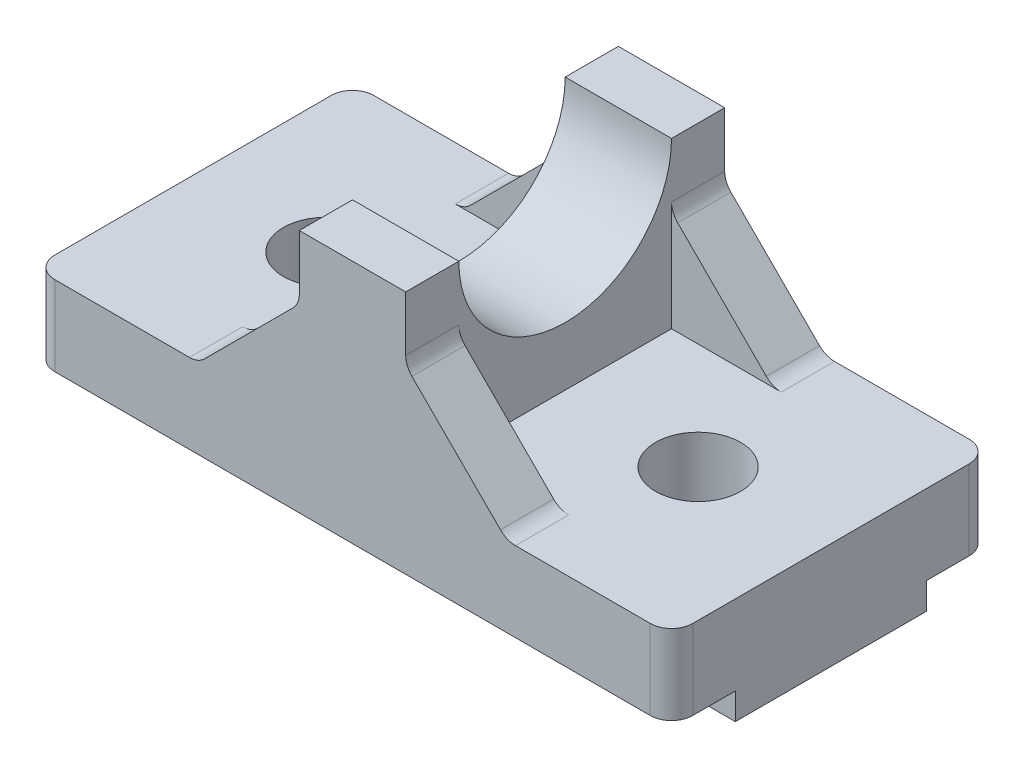
ISO-10303-21;
HEADER;
FILE_DESCRIPTION(('STEP AP214'),'2;1');
FILE_NAME('part.step','',(''),(''),'','','');
FILE_SCHEMA(('AUTOMOTIVE_DESIGN { 1 0 10303 214 1 1 1 1 }'));
ENDSEC;
DATA;
#1=APPLICATION_CONTEXT('core data for automotive mechanical design processes');
#2=APPLICATION_PROTOCOL_DEFINITION('international standard','automotive_design',2000,#1);
#3=PRODUCT_CONTEXT('',#1,'mechanical');
#4=PRODUCT('Part','Part','',(#3));
#5=PRODUCT_RELATED_PRODUCT_CATEGORY('part','',(#4));
#6=PRODUCT_DEFINITION_FORMATION('','',#4);
#7=PRODUCT_DEFINITION_CONTEXT('part definition',#1,'design');
#8=PRODUCT_DEFINITION('design','',#6,#7);
#9=PRODUCT_DEFINITION_SHAPE('','',#8);
#10=(LENGTH_UNIT() NAMED_UNIT(*) SI_UNIT(.MILLI.,.METRE.));
#11=(NAMED_UNIT(*) PLANE_ANGLE_UNIT() SI_UNIT($,.RADIAN.));
#12=(NAMED_UNIT(*) SI_UNIT($,.STERADIAN.) SOLID_ANGLE_UNIT());
#13=UNCERTAINTY_MEASURE_WITH_UNIT(LENGTH_MEASURE(1.E-05),#10,'distance_accuracy_value','');
#14=(GEOMETRIC_REPRESENTATION_CONTEXT(3) GLOBAL_UNCERTAINTY_ASSIGNED_CONTEXT((#13)) GLOBAL_UNIT_ASSIGNED_CONTEXT((#10,
#11,#12)) REPRESENTATION_CONTEXT('',''));
#15=CARTESIAN_POINT('',(0.,0.,0.));
#16=DIRECTION('',(0.,0.,1.));
#17=DIRECTION('',(1.,0.,0.));
#18=AXIS2_PLACEMENT_3D('',#15,#16,#17);
#19=CARTESIAN_POINT('',(10.,46.,30.));
#20=DIRECTION('',(0.,-1.,0.));
#21=DIRECTION('',(0.,0.,-1.));
#22=AXIS2_PLACEMENT_3D('',#19,#20,#21);
#23=PLANE('',#22);
#24=DIRECTION('',(1.,0.,0.));
#25=VECTOR('',#24,1.);
#26=CARTESIAN_POINT('',(-240.23417352045,45.9999999999999,20.));
#27=LINE('',#26,#25);
#28=CARTESIAN_POINT('',(-10.0000000000001,46.,20.));
#29=VERTEX_POINT('',#28);
#30=CARTESIAN_POINT('',(10.,46.,20.));
#31=VERTEX_POINT('',#30);
#32=EDGE_CURVE('E267',#29,#31,#27,.T.);
#33=ORIENTED_EDGE('',*,*,#32,.F.);
#34=DIRECTION('',(0.,0.,-1.));
#35=VECTOR('',#34,1.);
#36=CARTESIAN_POINT('',(-10.,46.,30.));
#37=LINE('',#36,#35);
#38=CARTESIAN_POINT('',(-10.,46.,30.));
#39=VERTEX_POINT('',#38);
#40=EDGE_CURVE('E256',#39,#29,#37,.T.);
#41=ORIENTED_EDGE('',*,*,#40,.F.);
#42=DIRECTION('',(-1.,0.,0.));
#43=VECTOR('',#42,1.);
#44=CARTESIAN_POINT('',(10.,46.,30.));
#45=LINE('',#44,#43);
#46=CARTESIAN_POINT('',(10.,46.,30.));
#47=VERTEX_POINT('',#46);
#48=EDGE_CURVE('E382',#47,#39,#45,.T.);
#49=ORIENTED_EDGE('',*,*,#48,.F.);
#50=DIRECTION('',(0.,0.,-1.));
#51=VECTOR('',#50,1.);
#52=CARTESIAN_POINT('',(10.,46.,30.));
#53=LINE('',#52,#51);
#54=EDGE_CURVE('E268',#47,#31,#53,.T.);
#55=ORIENTED_EDGE('',*,*,#54,.T.);
#56=EDGE_LOOP('',(#33,#41,#49,#55));
#57=FACE_BOUND('',#56,.T.);
#58=ADVANCED_FACE('F33',(#57),#23,.F.);
#59=CARTESIAN_POINT('',(30.6568542494922,19.,30.));
#60=DIRECTION('',(0.,0.,-1.));
#61=DIRECTION('',(-1.,0.,0.));
#62=AXIS2_PLACEMENT_3D('',#59,#60,#61);
#63=CYLINDRICAL_SURFACE('',#62,4.);
#64=CARTESIAN_POINT('',(30.6568542494922,19.,-20.));
#65=DIRECTION('',(0.,0.,1.));
#66=DIRECTION('',(1.,0.,0.));
#67=AXIS2_PLACEMENT_3D('',#64,#65,#66);
#68=CIRCLE('',#67,4.);
#69=CARTESIAN_POINT('',(30.6568542494922,15.,-20.));
#70=VERTEX_POINT('',#69);
#71=CARTESIAN_POINT('',(27.828427124746,16.1715728752538,-20.));
#72=VERTEX_POINT('',#71);
#73=EDGE_CURVE('E303',#70,#72,#68,.F.);
#74=ORIENTED_EDGE('',*,*,#73,.F.);
#75=DIRECTION('',(0.,0.,-1.));
#76=VECTOR('',#75,1.);
#77=CARTESIAN_POINT('',(30.6568542494922,15.,30.));
#78=LINE('',#77,#76);
#79=CARTESIAN_POINT('',(30.6568542494922,15.,-30.));
#80=VERTEX_POINT('',#79);
#81=EDGE_CURVE('E448',#70,#80,#78,.T.);
#82=ORIENTED_EDGE('',*,*,#81,.T.);
#83=CARTESIAN_POINT('',(30.6568542494922,19.,-30.));
#84=DIRECTION('',(0.,0.,-1.));
#85=DIRECTION('',(1.,0.,0.));
#86=AXIS2_PLACEMENT_3D('',#83,#84,#85);
#87=CIRCLE('',#86,4.);
#88=CARTESIAN_POINT('',(27.828427124746,16.1715728752538,-30.));
#89=VERTEX_POINT('',#88);
#90=EDGE_CURVE('E401',#80,#89,#87,.T.);
#91=ORIENTED_EDGE('',*,*,#90,.T.);
#92=DIRECTION('',(0.,0.,-1.));
#93=VECTOR('',#92,1.);
#94=CARTESIAN_POINT('',(27.828427124746,16.1715728752538,30.));
#95=LINE('',#94,#93);
#96=EDGE_CURVE('E444',#72,#89,#95,.T.);
#97=ORIENTED_EDGE('',*,*,#96,.F.);
#98=EDGE_LOOP('',(#74,#82,#91,#97));
#99=FACE_BOUND('',#98,.T.);
#100=ADVANCED_FACE('F582',(#99),#63,.F.);
#101=CARTESIAN_POINT('',(30.6568542494922,19.,20.));
#102=DIRECTION('',(0.,0.,-1.));
#103=DIRECTION('',(-1.,0.,0.));
#104=AXIS2_PLACEMENT_3D('',#101,#102,#103);
#105=CIRCLE('',#104,4.);
#106=CARTESIAN_POINT('',(27.828427124746,16.1715728752538,20.));
#107=VERTEX_POINT('',#106);
#108=CARTESIAN_POINT('',(30.6568542494922,15.,20.));
#109=VERTEX_POINT('',#108);
#110=EDGE_CURVE('E297',#107,#109,#105,.F.);
#111=ORIENTED_EDGE('',*,*,#110,.F.);
#112=CARTESIAN_POINT('',(27.828427124746,16.1715728752538,30.));
#113=VERTEX_POINT('',#112);
#114=EDGE_CURVE('E445',#113,#107,#95,.T.);
#115=ORIENTED_EDGE('',*,*,#114,.F.);
#116=CARTESIAN_POINT('',(30.6568542494922,19.,30.));
#117=DIRECTION('',(0.,0.,-1.));
#118=DIRECTION('',(1.,0.,0.));
#119=AXIS2_PLACEMENT_3D('',#116,#117,#118);
#120=CIRCLE('',#119,4.);
#121=CARTESIAN_POINT('',(30.6568542494922,15.,30.));
#122=VERTEX_POINT('',#121);
#123=EDGE_CURVE('E374',#122,#113,#120,.T.);
#124=ORIENTED_EDGE('',*,*,#123,.F.);
#125=EDGE_CURVE('E449',#122,#109,#78,.T.);
#126=ORIENTED_EDGE('',*,*,#125,.T.);
#127=EDGE_LOOP('',(#111,#115,#124,#126));
#128=FACE_BOUND('',#127,.T.);
#129=ADVANCED_FACE('F555',(#128),#63,.F.);
#130=CARTESIAN_POINT('',(11.1715728752538,32.8284271247462,30.));
#131=DIRECTION('',(-0.707106781186551,-0.707106781186544,0.));
#132=DIRECTION('',(0.707106781186544,-0.707106781186551,0.));
#133=AXIS2_PLACEMENT_3D('',#130,#131,#132);
#134=PLANE('',#133);
#135=DIRECTION('',(-0.707106781186544,0.707106781186551,0.));
#136=VECTOR('',#135,1.);
#137=CARTESIAN_POINT('',(11.1715728752538,32.8284271247462,-20.));
#138=LINE('',#137,#136);
#139=CARTESIAN_POINT('',(11.1715728752538,32.8284271247462,-20.));
#140=VERTEX_POINT('',#139);
#141=EDGE_CURVE('E301',#72,#140,#138,.T.);
#142=ORIENTED_EDGE('',*,*,#141,.F.);
#143=ORIENTED_EDGE('',*,*,#96,.T.);
#144=DIRECTION('',(-0.707106781186544,0.707106781186551,0.));
#145=VECTOR('',#144,1.);
#146=CARTESIAN_POINT('',(11.1715728752538,32.8284271247462,-30.));
#147=LINE('',#146,#145);
#148=CARTESIAN_POINT('',(11.1715728752538,32.8284271247462,-30.));
#149=VERTEX_POINT('',#148);
#150=EDGE_CURVE('E404',#89,#149,#147,.T.);
#151=ORIENTED_EDGE('',*,*,#150,.T.);
#152=DIRECTION('',(0.,0.,-1.));
#153=VECTOR('',#152,1.);
#154=CARTESIAN_POINT('',(11.1715728752538,32.8284271247462,30.));
#155=LINE('',#154,#153);
#156=EDGE_CURVE('E440',#140,#149,#155,.T.);
#157=ORIENTED_EDGE('',*,*,#156,.F.);
#158=EDGE_LOOP('',(#142,#143,#151,#157));
#159=FACE_BOUND('',#158,.T.);
#160=ADVANCED_FACE('F778',(#159),#134,.F.);
#161=DIRECTION('',(0.707106781186544,-0.707106781186551,0.));
#162=VECTOR('',#161,1.);
#163=CARTESIAN_POINT('',(11.1715728752538,32.8284271247462,20.));
#164=LINE('',#163,#162);
#165=CARTESIAN_POINT('',(11.1715728752538,32.8284271247462,20.));
#166=VERTEX_POINT('',#165);
#167=EDGE_CURVE('E295',#166,#107,#164,.T.);
#168=ORIENTED_EDGE('',*,*,#167,.F.);
#169=CARTESIAN_POINT('',(11.1715728752538,32.8284271247462,30.));
#170=VERTEX_POINT('',#169);
#171=EDGE_CURVE('E441',#170,#166,#155,.T.);
#172=ORIENTED_EDGE('',*,*,#171,.F.);
#173=DIRECTION('',(-0.707106781186544,0.707106781186551,0.));
#174=VECTOR('',#173,1.);
#175=CARTESIAN_POINT('',(11.1715728752538,32.8284271247462,30.));
#176=LINE('',#175,#174);
#177=EDGE_CURVE('E376',#113,#170,#176,.T.);
#178=ORIENTED_EDGE('',*,*,#177,.F.);
#179=ORIENTED_EDGE('',*,*,#114,.T.);
#180=EDGE_LOOP('',(#168,#172,#178,#179));
#181=FACE_BOUND('',#180,.T.);
#182=ADVANCED_FACE('F562',(#181),#134,.F.);
#183=CARTESIAN_POINT('',(14.,35.6568542494924,30.));
#184=DIRECTION('',(0.,0.,-1.));
#185=DIRECTION('',(-1.,0.,0.));
#186=AXIS2_PLACEMENT_3D('',#183,#184,#185);
#187=CYLINDRICAL_SURFACE('',#186,4.00000000000001);
#188=CARTESIAN_POINT('',(14.,35.6568542494924,-20.));
#189=DIRECTION('',(0.,0.,1.));
#190=DIRECTION('',(1.,0.,0.));
#191=AXIS2_PLACEMENT_3D('',#188,#189,#190);
#192=CIRCLE('',#191,4.00000000000001);
#193=CARTESIAN_POINT('',(10.,35.6568542494924,-20.));
#194=VERTEX_POINT('',#193);
#195=EDGE_CURVE('E299',#140,#194,#192,.F.);
#196=ORIENTED_EDGE('',*,*,#195,.F.);
#197=ORIENTED_EDGE('',*,*,#156,.T.);
#198=CARTESIAN_POINT('',(14.,35.6568542494924,-30.));
#199=DIRECTION('',(0.,0.,-1.));
#200=DIRECTION('',(1.,0.,0.));
#201=AXIS2_PLACEMENT_3D('',#198,#199,#200);
#202=CIRCLE('',#201,4.00000000000001);
#203=CARTESIAN_POINT('',(10.,35.6568542494924,-30.));
#204=VERTEX_POINT('',#203);
#205=EDGE_CURVE('E407',#149,#204,#202,.T.);
#206=ORIENTED_EDGE('',*,*,#205,.T.);
#207=DIRECTION('',(0.,0.,-1.));
#208=VECTOR('',#207,1.);
#209=CARTESIAN_POINT('',(10.,35.6568542494924,30.));
#210=LINE('',#209,#208);
#211=EDGE_CURVE('E436',#194,#204,#210,.T.);
#212=ORIENTED_EDGE('',*,*,#211,.F.);
#213=EDGE_LOOP('',(#196,#197,#206,#212));
#214=FACE_BOUND('',#213,.T.);
#215=ADVANCED_FACE('F793',(#214),#187,.F.);
#216=CARTESIAN_POINT('',(14.,35.6568542494924,20.));
#217=DIRECTION('',(0.,0.,-1.));
#218=DIRECTION('',(-1.,0.,0.));
#219=AXIS2_PLACEMENT_3D('',#216,#217,#218);
#220=CIRCLE('',#219,4.00000000000001);
#221=CARTESIAN_POINT('',(10.,35.6568542494924,20.));
#222=VERTEX_POINT('',#221);
#223=EDGE_CURVE('E292',#222,#166,#220,.F.);
#224=ORIENTED_EDGE('',*,*,#223,.F.);
#225=CARTESIAN_POINT('',(10.,35.6568542494924,30.));
#226=VERTEX_POINT('',#225);
#227=EDGE_CURVE('E437',#226,#222,#210,.T.);
#228=ORIENTED_EDGE('',*,*,#227,.F.);
#229=CARTESIAN_POINT('',(14.,35.6568542494924,30.));
#230=DIRECTION('',(0.,0.,-1.));
#231=DIRECTION('',(1.,0.,0.));
#232=AXIS2_PLACEMENT_3D('',#229,#230,#231);
#233=CIRCLE('',#232,4.00000000000001);
#234=EDGE_CURVE('E378',#170,#226,#233,.T.);
#235=ORIENTED_EDGE('',*,*,#234,.F.);
#236=ORIENTED_EDGE('',*,*,#171,.T.);
#237=EDGE_LOOP('',(#224,#228,#235,#236));
#238=FACE_BOUND('',#237,.T.);
#239=ADVANCED_FACE('F565',(#238),#187,.F.);
#240=CARTESIAN_POINT('',(-30.6568542494922,19.,30.));
#241=DIRECTION('',(0.,0.,-1.));
#242=DIRECTION('',(-1.,0.,0.));
#243=AXIS2_PLACEMENT_3D('',#240,#241,#242);
#244=CYLINDRICAL_SURFACE('',#243,4.);
#245=DIRECTION('',(0.,0.,-1.));
#246=VECTOR('',#245,1.);
#247=CARTESIAN_POINT('',(-27.828427124746,16.1715728752538,30.));
#248=LINE('',#247,#246);
#249=CARTESIAN_POINT('',(-27.828427124746,16.1715728752538,30.));
#250=VERTEX_POINT('',#249);
#251=CARTESIAN_POINT('',(-27.828427124746,16.1715728752538,20.));
#252=VERTEX_POINT('',#251);
#253=EDGE_CURVE('E424',#250,#252,#248,.T.);
#254=ORIENTED_EDGE('',*,*,#253,.T.);
#255=CARTESIAN_POINT('',(-30.6568542494922,19.,20.));
#256=DIRECTION('',(0.,0.,1.));
#257=DIRECTION('',(1.,0.,0.));
#258=AXIS2_PLACEMENT_3D('',#255,#256,#257);
#259=CIRCLE('',#258,4.);
#260=CARTESIAN_POINT('',(-30.6568542494922,15.,20.));
#261=VERTEX_POINT('',#260);
#262=EDGE_CURVE('E334',#252,#261,#259,.F.);
#263=ORIENTED_EDGE('',*,*,#262,.T.);
#264=DIRECTION('',(0.,0.,-1.));
#265=VECTOR('',#264,1.);
#266=CARTESIAN_POINT('',(-30.6568542494922,15.,30.));
#267=LINE('',#266,#265);
#268=CARTESIAN_POINT('',(-30.6568542494922,15.,30.));
#269=VERTEX_POINT('',#268);
#270=EDGE_CURVE('E465',#269,#261,#267,.T.);
#271=ORIENTED_EDGE('',*,*,#270,.F.);
#272=CARTESIAN_POINT('',(-30.6568542494922,19.,30.));
#273=DIRECTION('',(0.,0.,-1.));
#274=DIRECTION('',(-1.,0.,0.));
#275=AXIS2_PLACEMENT_3D('',#272,#273,#274);
#276=CIRCLE('',#275,4.);
#277=EDGE_CURVE('E362',#250,#269,#276,.T.);
#278=ORIENTED_EDGE('',*,*,#277,.F.);
#279=EDGE_LOOP('',(#254,#263,#271,#278));
#280=FACE_BOUND('',#279,.T.);
#281=ADVANCED_FACE('F515',(#280),#244,.F.);
#282=CARTESIAN_POINT('',(-14.,35.6568542494924,30.));
#283=DIRECTION('',(0.,0.,-1.));
#284=DIRECTION('',(-1.,0.,0.));
#285=AXIS2_PLACEMENT_3D('',#282,#283,#284);
#286=CYLINDRICAL_SURFACE('',#285,4.);
#287=DIRECTION('',(0.,0.,-1.));
#288=VECTOR('',#287,1.);
#289=CARTESIAN_POINT('',(-10.,35.6568542494924,30.));
#290=LINE('',#289,#288);
#291=CARTESIAN_POINT('',(-10.,35.6568542494924,30.));
#292=VERTEX_POINT('',#291);
#293=CARTESIAN_POINT('',(-10.,35.6568542494924,20.));
#294=VERTEX_POINT('',#293);
#295=EDGE_CURVE('E432',#292,#294,#290,.T.);
#296=ORIENTED_EDGE('',*,*,#295,.T.);
#297=CARTESIAN_POINT('',(-14.,35.6568542494924,20.));
#298=DIRECTION('',(0.,0.,1.));
#299=DIRECTION('',(1.,0.,0.));
#300=AXIS2_PLACEMENT_3D('',#297,#298,#299);
#301=CIRCLE('',#300,4.);
#302=CARTESIAN_POINT('',(-11.1715728752538,32.8284271247462,20.));
#303=VERTEX_POINT('',#302);
#304=EDGE_CURVE('E331',#294,#303,#301,.F.);
#305=ORIENTED_EDGE('',*,*,#304,.T.);
#306=DIRECTION('',(0.,0.,-1.));
#307=VECTOR('',#306,1.);
#308=CARTESIAN_POINT('',(-11.1715728752538,32.8284271247462,30.));
#309=LINE('',#308,#307);
#310=CARTESIAN_POINT('',(-11.1715728752538,32.8284271247462,30.));
#311=VERTEX_POINT('',#310);
#312=EDGE_CURVE('E428',#311,#303,#309,.T.);
#313=ORIENTED_EDGE('',*,*,#312,.F.);
#314=CARTESIAN_POINT('',(-14.,35.6568542494924,30.));
#315=DIRECTION('',(0.,0.,-1.));
#316=DIRECTION('',(-1.,0.,0.));
#317=AXIS2_PLACEMENT_3D('',#314,#315,#316);
#318=CIRCLE('',#317,4.);
#319=EDGE_CURVE('E385',#292,#311,#318,.T.);
#320=ORIENTED_EDGE('',*,*,#319,.F.);
#321=EDGE_LOOP('',(#296,#305,#313,#320));
#322=FACE_BOUND('',#321,.T.);
#323=ADVANCED_FACE('F522',(#322),#286,.F.);
#324=CARTESIAN_POINT('',(-11.1715728752538,32.8284271247462,30.));
#325=DIRECTION('',(0.707106781186552,-0.707106781186543,0.));
#326=DIRECTION('',(0.707106781186543,0.707106781186552,0.));
#327=AXIS2_PLACEMENT_3D('',#324,#325,#326);
#328=PLANE('',#327);
#329=ORIENTED_EDGE('',*,*,#312,.T.);
#330=DIRECTION('',(-0.707106781186543,-0.707106781186552,0.));
#331=VECTOR('',#330,1.);
#332=CARTESIAN_POINT('',(-11.1715728752538,32.8284271247462,20.));
#333=LINE('',#332,#331);
#334=EDGE_CURVE('E41',#303,#252,#333,.T.);
#335=ORIENTED_EDGE('',*,*,#334,.T.);
#336=ORIENTED_EDGE('',*,*,#253,.F.);
#337=DIRECTION('',(-0.707106781186543,-0.707106781186552,0.));
#338=VECTOR('',#337,1.);
#339=CARTESIAN_POINT('',(-11.1715728752538,32.8284271247462,30.));
#340=LINE('',#339,#338);
#341=EDGE_CURVE('E387',#311,#250,#340,.T.);
#342=ORIENTED_EDGE('',*,*,#341,.F.);
#343=EDGE_LOOP('',(#329,#335,#336,#342));
#344=FACE_BOUND('',#343,.T.);
#345=ADVANCED_FACE('F509',(#344),#328,.F.);
#346=CARTESIAN_POINT('',(-60.,0.,30.));
#347=DIRECTION('',(0.,1.,0.));
#348=DIRECTION('',(0.,0.,1.));
#349=AXIS2_PLACEMENT_3D('',#346,#347,#348);
#350=PLANE('',#349);
#351=DIRECTION('',(0.,0.,-1.));
#352=VECTOR('',#351,1.);
#353=CARTESIAN_POINT('',(60.,0.,30.));
#354=LINE('',#353,#352);
#355=CARTESIAN_POINT('',(60.,0.,26.));
#356=VERTEX_POINT('',#355);
#357=CARTESIAN_POINT('',(60.,0.,18.));
#358=VERTEX_POINT('',#357);
#359=EDGE_CURVE('E456',#356,#358,#354,.T.);
#360=ORIENTED_EDGE('',*,*,#359,.F.);
#361=CARTESIAN_POINT('',(56.,0.,26.));
#362=DIRECTION('',(0.,1.,0.));
#363=DIRECTION('',(0.,0.,1.));
#364=AXIS2_PLACEMENT_3D('',#361,#362,#363);
#365=CIRCLE('',#364,4.);
#366=CARTESIAN_POINT('',(56.,0.,30.));
#367=VERTEX_POINT('',#366);
#368=EDGE_CURVE('E502',#356,#367,#365,.F.);
#369=ORIENTED_EDGE('',*,*,#368,.T.);
#370=DIRECTION('',(1.,0.,0.));
#371=VECTOR('',#370,1.);
#372=CARTESIAN_POINT('',(-60.,0.,30.));
#373=LINE('',#372,#371);
#374=CARTESIAN_POINT('',(-56.,0.,30.));
#375=VERTEX_POINT('',#374);
#376=EDGE_CURVE('E369',#375,#367,#373,.T.);
#377=ORIENTED_EDGE('',*,*,#376,.F.);
#378=CARTESIAN_POINT('',(-56.,0.,26.));
#379=DIRECTION('',(0.,1.,0.));
#380=DIRECTION('',(0.,0.,1.));
#381=AXIS2_PLACEMENT_3D('',#378,#379,#380);
#382=CIRCLE('',#381,4.);
#383=CARTESIAN_POINT('',(-60.,0.,26.));
#384=VERTEX_POINT('',#383);
#385=EDGE_CURVE('E500',#375,#384,#382,.F.);
#386=ORIENTED_EDGE('',*,*,#385,.T.);
#387=DIRECTION('',(0.,0.,-1.));
#388=VECTOR('',#387,1.);
#389=CARTESIAN_POINT('',(-60.,0.,30.));
#390=LINE('',#389,#388);
#391=CARTESIAN_POINT('',(-60.,0.,18.));
#392=VERTEX_POINT('',#391);
#393=EDGE_CURVE('E459',#384,#392,#390,.T.);
#394=ORIENTED_EDGE('',*,*,#393,.T.);
#395=DIRECTION('',(-1.,0.,0.));
#396=VECTOR('',#395,1.);
#397=CARTESIAN_POINT('',(60.,0.,18.));
#398=LINE('',#397,#396);
#399=EDGE_CURVE('E355',#358,#392,#398,.T.);
#400=ORIENTED_EDGE('',*,*,#399,.F.);
#401=EDGE_LOOP('',(#360,#369,#377,#386,#394,#400));
#402=FACE_BOUND('',#401,.T.);
#403=ADVANCED_FACE('F537',(#402),#350,.F.);
#404=CARTESIAN_POINT('',(-30.6568542494922,15.,-20.));
#405=VERTEX_POINT('',#404);
#406=CARTESIAN_POINT('',(-30.6568542494922,15.,-30.));
#407=VERTEX_POINT('',#406);
#408=EDGE_CURVE('E464',#405,#407,#267,.T.);
#409=ORIENTED_EDGE('',*,*,#408,.F.);
#410=CARTESIAN_POINT('',(-30.6568542494922,19.,-20.));
#411=DIRECTION('',(0.,0.,-1.));
#412=DIRECTION('',(-1.,0.,0.));
#413=AXIS2_PLACEMENT_3D('',#410,#411,#412);
#414=CIRCLE('',#413,4.);
#415=CARTESIAN_POINT('',(-27.828427124746,16.1715728752538,-20.));
#416=VERTEX_POINT('',#415);
#417=EDGE_CURVE('E328',#405,#416,#414,.F.);
#418=ORIENTED_EDGE('',*,*,#417,.T.);
#419=CARTESIAN_POINT('',(-27.828427124746,16.1715728752538,-30.));
#420=VERTEX_POINT('',#419);
#421=EDGE_CURVE('E389',#416,#420,#248,.T.);
#422=ORIENTED_EDGE('',*,*,#421,.T.);
#423=CARTESIAN_POINT('',(-30.6568542494922,19.,-30.));
#424=DIRECTION('',(0.,0.,-1.));
#425=DIRECTION('',(-1.,0.,0.));
#426=AXIS2_PLACEMENT_3D('',#423,#424,#425);
#427=CIRCLE('',#426,4.);
#428=EDGE_CURVE('E361',#420,#407,#427,.T.);
#429=ORIENTED_EDGE('',*,*,#428,.T.);
#430=EDGE_LOOP('',(#409,#418,#422,#429));
#431=FACE_BOUND('',#430,.T.);
#432=ADVANCED_FACE('F823',(#431),#244,.F.);
#433=CARTESIAN_POINT('',(-30.6568542494922,15.,30.));
#434=DIRECTION('',(0.,-1.,0.));
#435=DIRECTION('',(1.,0.,0.));
#436=AXIS2_PLACEMENT_3D('',#433,#434,#435);
#437=PLANE('',#436);
#438=CARTESIAN_POINT('',(-35.,15.,0.));
#439=DIRECTION('',(0.,1.,0.));
#440=DIRECTION('',(-1.,0.,0.));
#441=AXIS2_PLACEMENT_3D('',#438,#439,#440);
#442=CIRCLE('',#441,8.);
#443=CARTESIAN_POINT('',(-43.,15.,0.));
#444=VERTEX_POINT('',#443);
#445=EDGE_CURVE('E305',#444,#444,#442,.T.);
#446=ORIENTED_EDGE('',*,*,#445,.F.);
#447=EDGE_LOOP('',(#446));
#448=FACE_BOUND('',#447,.T.);
#449=DIRECTION('',(-1.,0.,0.));
#450=VECTOR('',#449,1.);
#451=CARTESIAN_POINT('',(-30.6568542494922,15.,-30.));
#452=LINE('',#451,#450);
#453=CARTESIAN_POINT('',(-56.,15.,-30.));
#454=VERTEX_POINT('',#453);
#455=EDGE_CURVE('E392',#407,#454,#452,.T.);
#456=ORIENTED_EDGE('',*,*,#455,.T.);
#457=CARTESIAN_POINT('',(-56.,15.,-26.));
#458=DIRECTION('',(0.,-1.,0.));
#459=DIRECTION('',(1.,0.,0.));
#460=AXIS2_PLACEMENT_3D('',#457,#458,#459);
#461=CIRCLE('',#460,4.);
#462=CARTESIAN_POINT('',(-60.,15.,-26.));
#463=VERTEX_POINT('',#462);
#464=EDGE_CURVE('E483',#454,#463,#461,.F.);
#465=ORIENTED_EDGE('',*,*,#464,.T.);
#466=DIRECTION('',(0.,0.,-1.));
#467=VECTOR('',#466,1.);
#468=CARTESIAN_POINT('',(-60.,15.,30.));
#469=LINE('',#468,#467);
#470=CARTESIAN_POINT('',(-60.,15.,26.));
#471=VERTEX_POINT('',#470);
#472=EDGE_CURVE('E461',#471,#463,#469,.T.);
#473=ORIENTED_EDGE('',*,*,#472,.F.);
#474=CARTESIAN_POINT('',(-56.,15.,26.));
#475=DIRECTION('',(0.,-1.,0.));
#476=DIRECTION('',(1.,0.,0.));
#477=AXIS2_PLACEMENT_3D('',#474,#475,#476);
#478=CIRCLE('',#477,4.);
#479=CARTESIAN_POINT('',(-56.,15.,30.));
#480=VERTEX_POINT('',#479);
#481=EDGE_CURVE('E481',#471,#480,#478,.F.);
#482=ORIENTED_EDGE('',*,*,#481,.T.);
#483=DIRECTION('',(-1.,0.,0.));
#484=VECTOR('',#483,1.);
#485=CARTESIAN_POINT('',(-30.6568542494922,15.,30.));
#486=LINE('',#485,#484);
#487=EDGE_CURVE('E365',#269,#480,#486,.T.);
#488=ORIENTED_EDGE('',*,*,#487,.F.);
#489=ORIENTED_EDGE('',*,*,#270,.T.);
#490=DIRECTION('',(1.,0.,0.));
#491=VECTOR('',#490,1.);
#492=CARTESIAN_POINT('',(-10.,15.,20.));
#493=LINE('',#492,#491);
#494=CARTESIAN_POINT('',(-10.,15.,20.));
#495=VERTEX_POINT('',#494);
#496=EDGE_CURVE('E317',#261,#495,#493,.T.);
#497=ORIENTED_EDGE('',*,*,#496,.T.);
#498=DIRECTION('',(0.,0.,-1.));
#499=VECTOR('',#498,1.);
#500=CARTESIAN_POINT('',(-10.,15.,-20.));
#501=LINE('',#500,#499);
#502=CARTESIAN_POINT('',(-10.,15.,-20.));
#503=VERTEX_POINT('',#502);
#504=EDGE_CURVE('E311',#495,#503,#501,.T.);
#505=ORIENTED_EDGE('',*,*,#504,.T.);
#506=DIRECTION('',(-1.,0.,0.));
#507=VECTOR('',#506,1.);
#508=CARTESIAN_POINT('',(-10.,15.,-20.));
#509=LINE('',#508,#507);
#510=EDGE_CURVE('E314',#503,#405,#509,.T.);
#511=ORIENTED_EDGE('',*,*,#510,.T.);
#512=ORIENTED_EDGE('',*,*,#408,.T.);
#513=EDGE_LOOP('',(#456,#465,#473,#482,#488,#489,#497,#505,#511,#512));
#514=FACE_BOUND('',#513,.T.);
#515=ADVANCED_FACE('F528',(#448,#514),#437,.F.);
#516=CARTESIAN_POINT('',(-60.,15.,30.));
#517=DIRECTION('',(1.,0.,0.));
#518=DIRECTION('',(0.,0.,-1.));
#519=AXIS2_PLACEMENT_3D('',#516,#517,#518);
#520=PLANE('',#519);
#521=ORIENTED_EDGE('',*,*,#472,.T.);
#522=DIRECTION('',(0.,-1.,0.));
#523=VECTOR('',#522,1.);
#524=CARTESIAN_POINT('',(-60.,0.,-26.));
#525=LINE('',#524,#523);
#526=CARTESIAN_POINT('',(-60.,0.,-26.));
#527=VERTEX_POINT('',#526);
#528=EDGE_CURVE('E470',#463,#527,#525,.T.);
#529=ORIENTED_EDGE('',*,*,#528,.T.);
#530=CARTESIAN_POINT('',(-60.,0.,-18.));
#531=VERTEX_POINT('',#530);
#532=EDGE_CURVE('E458',#531,#527,#390,.T.);
#533=ORIENTED_EDGE('',*,*,#532,.F.);
#534=DIRECTION('',(0.,1.,0.));
#535=VECTOR('',#534,1.);
#536=CARTESIAN_POINT('',(-60.,-5.,-18.));
#537=LINE('',#536,#535);
#538=CARTESIAN_POINT('',(-60.,-5.,-18.));
#539=VERTEX_POINT('',#538);
#540=EDGE_CURVE('E337',#539,#531,#537,.T.);
#541=ORIENTED_EDGE('',*,*,#540,.F.);
#542=DIRECTION('',(0.,0.,-1.));
#543=VECTOR('',#542,1.);
#544=CARTESIAN_POINT('',(-60.,-5.,18.));
#545=LINE('',#544,#543);
#546=CARTESIAN_POINT('',(-60.,-5.,18.));
#547=VERTEX_POINT('',#546);
#548=EDGE_CURVE('E341',#547,#539,#545,.T.);
#549=ORIENTED_EDGE('',*,*,#548,.F.);
#550=DIRECTION('',(0.,-1.,0.));
#551=VECTOR('',#550,1.);
#552=CARTESIAN_POINT('',(-60.,-5.,18.));
#553=LINE('',#552,#551);
#554=EDGE_CURVE('E347',#392,#547,#553,.T.);
#555=ORIENTED_EDGE('',*,*,#554,.F.);
#556=ORIENTED_EDGE('',*,*,#393,.F.);
#557=DIRECTION('',(0.,-1.,0.));
#558=VECTOR('',#557,1.);
#559=CARTESIAN_POINT('',(-60.,15.,26.));
#560=LINE('',#559,#558);
#561=EDGE_CURVE('E468',#384,#471,#560,.F.);
#562=ORIENTED_EDGE('',*,*,#561,.T.);
#563=EDGE_LOOP('',(#521,#529,#533,#541,#549,#555,#556,#562));
#564=FACE_BOUND('',#563,.T.);
#565=ADVANCED_FACE('F822',(#564),#520,.F.);
#566=ORIENTED_EDGE('',*,*,#532,.T.);
#567=CARTESIAN_POINT('',(-56.,0.,-26.));
#568=DIRECTION('',(0.,1.,0.));
#569=DIRECTION('',(0.,0.,1.));
#570=AXIS2_PLACEMENT_3D('',#567,#568,#569);
#571=CIRCLE('',#570,4.);
#572=CARTESIAN_POINT('',(-56.,0.,-30.));
#573=VERTEX_POINT('',#572);
#574=EDGE_CURVE('E475',#527,#573,#571,.F.);
#575=ORIENTED_EDGE('',*,*,#574,.T.);
#576=DIRECTION('',(1.,0.,0.));
#577=VECTOR('',#576,1.);
#578=CARTESIAN_POINT('',(-60.,0.,-30.));
#579=LINE('',#578,#577);
#580=CARTESIAN_POINT('',(56.,0.,-30.));
#581=VERTEX_POINT('',#580);
#582=EDGE_CURVE('E395',#573,#581,#579,.T.);
#583=ORIENTED_EDGE('',*,*,#582,.T.);
#584=CARTESIAN_POINT('',(56.,0.,-26.));
#585=DIRECTION('',(0.,1.,0.));
#586=DIRECTION('',(0.,0.,1.));
#587=AXIS2_PLACEMENT_3D('',#584,#585,#586);
#588=CIRCLE('',#587,4.);
#589=CARTESIAN_POINT('',(60.,0.,-26.));
#590=VERTEX_POINT('',#589);
#591=EDGE_CURVE('E473',#581,#590,#588,.F.);
#592=ORIENTED_EDGE('',*,*,#591,.T.);
#593=CARTESIAN_POINT('',(60.,0.,-18.));
#594=VERTEX_POINT('',#593);
#595=EDGE_CURVE('E455',#594,#590,#354,.T.);
#596=ORIENTED_EDGE('',*,*,#595,.F.);
#597=DIRECTION('',(-1.,0.,0.));
#598=VECTOR('',#597,1.);
#599=CARTESIAN_POINT('',(60.,0.,-18.));
#600=LINE('',#599,#598);
#601=EDGE_CURVE('E358',#594,#531,#600,.T.);
#602=ORIENTED_EDGE('',*,*,#601,.T.);
#603=EDGE_LOOP('',(#566,#575,#583,#592,#596,#602));
#604=FACE_BOUND('',#603,.T.);
#605=ADVANCED_FACE('F867',(#604),#350,.F.);
#606=CARTESIAN_POINT('',(60.,15.,30.));
#607=DIRECTION('',(-1.,0.,0.));
#608=DIRECTION('',(0.,0.,1.));
#609=AXIS2_PLACEMENT_3D('',#606,#607,#608);
#610=PLANE('',#609);
#611=ORIENTED_EDGE('',*,*,#595,.T.);
#612=DIRECTION('',(0.,1.,0.));
#613=VECTOR('',#612,1.);
#614=CARTESIAN_POINT('',(60.,15.,-26.));
#615=LINE('',#614,#613);
#616=CARTESIAN_POINT('',(60.,15.,-26.));
#617=VERTEX_POINT('',#616);
#618=EDGE_CURVE('E487',#590,#617,#615,.T.);
#619=ORIENTED_EDGE('',*,*,#618,.T.);
#620=DIRECTION('',(0.,0.,-1.));
#621=VECTOR('',#620,1.);
#622=CARTESIAN_POINT('',(60.,15.,30.));
#623=LINE('',#622,#621);
#624=CARTESIAN_POINT('',(60.,15.,26.));
#625=VERTEX_POINT('',#624);
#626=EDGE_CURVE('E452',#625,#617,#623,.T.);
#627=ORIENTED_EDGE('',*,*,#626,.F.);
#628=DIRECTION('',(0.,1.,0.));
#629=VECTOR('',#628,1.);
#630=CARTESIAN_POINT('',(60.,15.,26.));
#631=LINE('',#630,#629);
#632=EDGE_CURVE('E485',#625,#356,#631,.F.);
#633=ORIENTED_EDGE('',*,*,#632,.T.);
#634=ORIENTED_EDGE('',*,*,#359,.T.);
#635=DIRECTION('',(0.,-1.,0.));
#636=VECTOR('',#635,1.);
#637=CARTESIAN_POINT('',(60.,-5.,18.));
#638=LINE('',#637,#636);
#639=CARTESIAN_POINT('',(60.,-5.,18.));
#640=VERTEX_POINT('',#639);
#641=EDGE_CURVE('E340',#358,#640,#638,.T.);
#642=ORIENTED_EDGE('',*,*,#641,.T.);
#643=DIRECTION('',(0.,0.,-1.));
#644=VECTOR('',#643,1.);
#645=CARTESIAN_POINT('',(60.,-5.,18.));
#646=LINE('',#645,#644);
#647=CARTESIAN_POINT('',(60.,-5.,-18.));
#648=VERTEX_POINT('',#647);
#649=EDGE_CURVE('E343',#640,#648,#646,.T.);
#650=ORIENTED_EDGE('',*,*,#649,.T.);
#651=DIRECTION('',(0.,1.,0.));
#652=VECTOR('',#651,1.);
#653=CARTESIAN_POINT('',(60.,-5.,-18.));
#654=LINE('',#653,#652);
#655=EDGE_CURVE('E338',#648,#594,#654,.T.);
#656=ORIENTED_EDGE('',*,*,#655,.T.);
#657=EDGE_LOOP('',(#611,#619,#627,#633,#634,#642,#650,#656));
#658=FACE_BOUND('',#657,.T.);
#659=ADVANCED_FACE('F577',(#658),#610,.F.);
#660=CARTESIAN_POINT('',(30.6568542494922,15.,30.));
#661=DIRECTION('',(0.,-1.,0.));
#662=DIRECTION('',(1.,0.,0.));
#663=AXIS2_PLACEMENT_3D('',#660,#661,#662);
#664=PLANE('',#663);
#665=CARTESIAN_POINT('',(35.,15.,0.));
#666=DIRECTION('',(0.,-1.,0.));
#667=DIRECTION('',(1.,0.,0.));
#668=AXIS2_PLACEMENT_3D('',#665,#666,#667);
#669=CIRCLE('',#668,8.);
#670=CARTESIAN_POINT('',(43.,15.,0.));
#671=VERTEX_POINT('',#670);
#672=EDGE_CURVE('E276',#671,#671,#669,.T.);
#673=ORIENTED_EDGE('',*,*,#672,.T.);
#674=EDGE_LOOP('',(#673));
#675=FACE_BOUND('',#674,.T.);
#676=ORIENTED_EDGE('',*,*,#626,.T.);
#677=CARTESIAN_POINT('',(56.,15.,-26.));
#678=DIRECTION('',(0.,-1.,0.));
#679=DIRECTION('',(1.,0.,0.));
#680=AXIS2_PLACEMENT_3D('',#677,#678,#679);
#681=CIRCLE('',#680,4.);
#682=CARTESIAN_POINT('',(56.,15.,-30.));
#683=VERTEX_POINT('',#682);
#684=EDGE_CURVE('E492',#617,#683,#681,.F.);
#685=ORIENTED_EDGE('',*,*,#684,.T.);
#686=DIRECTION('',(-1.,0.,0.));
#687=VECTOR('',#686,1.);
#688=CARTESIAN_POINT('',(30.6568542494922,15.,-30.));
#689=LINE('',#688,#687);
#690=EDGE_CURVE('E398',#683,#80,#689,.T.);
#691=ORIENTED_EDGE('',*,*,#690,.T.);
#692=ORIENTED_EDGE('',*,*,#81,.F.);
#693=DIRECTION('',(1.,0.,0.));
#694=VECTOR('',#693,1.);
#695=CARTESIAN_POINT('',(10.,15.,-20.));
#696=LINE('',#695,#694);
#697=CARTESIAN_POINT('',(10.,15.,-20.));
#698=VERTEX_POINT('',#697);
#699=EDGE_CURVE('E286',#698,#70,#696,.T.);
#700=ORIENTED_EDGE('',*,*,#699,.F.);
#701=DIRECTION('',(0.,0.,-1.));
#702=VECTOR('',#701,1.);
#703=CARTESIAN_POINT('',(10.,15.,-20.));
#704=LINE('',#703,#702);
#705=CARTESIAN_POINT('',(10.,15.,20.));
#706=VERTEX_POINT('',#705);
#707=EDGE_CURVE('E279',#706,#698,#704,.T.);
#708=ORIENTED_EDGE('',*,*,#707,.F.);
#709=DIRECTION('',(-1.,0.,0.));
#710=VECTOR('',#709,1.);
#711=CARTESIAN_POINT('',(10.,15.,20.));
#712=LINE('',#711,#710);
#713=EDGE_CURVE('E284',#109,#706,#712,.T.);
#714=ORIENTED_EDGE('',*,*,#713,.F.);
#715=ORIENTED_EDGE('',*,*,#125,.F.);
#716=DIRECTION('',(-1.,0.,0.));
#717=VECTOR('',#716,1.);
#718=CARTESIAN_POINT('',(30.6568542494922,15.,30.));
#719=LINE('',#718,#717);
#720=CARTESIAN_POINT('',(56.,15.,30.));
#721=VERTEX_POINT('',#720);
#722=EDGE_CURVE('E372',#721,#122,#719,.T.);
#723=ORIENTED_EDGE('',*,*,#722,.F.);
#724=CARTESIAN_POINT('',(56.,15.,26.));
#725=DIRECTION('',(0.,-1.,0.));
#726=DIRECTION('',(1.,0.,0.));
#727=AXIS2_PLACEMENT_3D('',#724,#725,#726);
#728=CIRCLE('',#727,4.);
#729=EDGE_CURVE('E490',#721,#625,#728,.F.);
#730=ORIENTED_EDGE('',*,*,#729,.T.);
#731=EDGE_LOOP('',(#676,#685,#691,#692,#700,#708,#714,#715,#723,#730));
#732=FACE_BOUND('',#731,.T.);
#733=ADVANCED_FACE('F547',(#675,#732),#664,.F.);
#734=CARTESIAN_POINT('',(10.,46.,30.));
#735=DIRECTION('',(-1.,0.,0.));
#736=DIRECTION('',(0.,-1.,0.));
#737=AXIS2_PLACEMENT_3D('',#734,#735,#736);
#738=PLANE('',#737);
#739=CARTESIAN_POINT('',(10.,46.,0.));
#740=DIRECTION('',(-1.,0.,0.));
#741=DIRECTION('',(0.,-1.,0.));
#742=AXIS2_PLACEMENT_3D('',#739,#740,#741);
#743=CIRCLE('',#742,20.);
#744=CARTESIAN_POINT('',(10.,46.,-20.));
#745=VERTEX_POINT('',#744);
#746=EDGE_CURVE('E55',#31,#745,#743,.F.);
#747=ORIENTED_EDGE('',*,*,#746,.F.);
#748=ORIENTED_EDGE('',*,*,#54,.F.);
#749=DIRECTION('',(0.,1.,0.));
#750=VECTOR('',#749,1.);
#751=CARTESIAN_POINT('',(10.,46.,30.));
#752=LINE('',#751,#750);
#753=EDGE_CURVE('E380',#226,#47,#752,.T.);
#754=ORIENTED_EDGE('',*,*,#753,.F.);
#755=ORIENTED_EDGE('',*,*,#227,.T.);
#756=DIRECTION('',(0.,1.,0.));
#757=VECTOR('',#756,1.);
#758=CARTESIAN_POINT('',(10.,15.,20.));
#759=LINE('',#758,#757);
#760=EDGE_CURVE('E288',#706,#222,#759,.T.);
#761=ORIENTED_EDGE('',*,*,#760,.F.);
#762=ORIENTED_EDGE('',*,*,#707,.T.);
#763=DIRECTION('',(0.,1.,0.));
#764=VECTOR('',#763,1.);
#765=CARTESIAN_POINT('',(10.,15.,-20.));
#766=LINE('',#765,#764);
#767=EDGE_CURVE('E289',#698,#194,#766,.T.);
#768=ORIENTED_EDGE('',*,*,#767,.T.);
#769=ORIENTED_EDGE('',*,*,#211,.T.);
#770=DIRECTION('',(0.,1.,0.));
#771=VECTOR('',#770,1.);
#772=CARTESIAN_POINT('',(10.,46.,-30.));
#773=LINE('',#772,#771);
#774=CARTESIAN_POINT('',(10.,46.,-30.));
#775=VERTEX_POINT('',#774);
#776=EDGE_CURVE('E410',#204,#775,#773,.T.);
#777=ORIENTED_EDGE('',*,*,#776,.T.);
#778=EDGE_CURVE('E263',#745,#775,#53,.T.);
#779=ORIENTED_EDGE('',*,*,#778,.F.);
#780=EDGE_LOOP('',(#747,#748,#754,#755,#761,#762,#768,#769,#777,#779));
#781=FACE_BOUND('',#780,.T.);
#782=ADVANCED_FACE('F568',(#781),#738,.F.);
#783=CARTESIAN_POINT('',(-10.,46.,-20.));
#784=VERTEX_POINT('',#783);
#785=CARTESIAN_POINT('',(-10.,46.,-30.));
#786=VERTEX_POINT('',#785);
#787=EDGE_CURVE('E264',#784,#786,#37,.T.);
#788=ORIENTED_EDGE('',*,*,#787,.F.);
#789=DIRECTION('',(1.,0.,0.));
#790=VECTOR('',#789,1.);
#791=CARTESIAN_POINT('',(-240.23417352045,46.,-20.));
#792=LINE('',#791,#790);
#793=EDGE_CURVE('E48',#784,#745,#792,.T.);
#794=ORIENTED_EDGE('',*,*,#793,.T.);
#795=ORIENTED_EDGE('',*,*,#778,.T.);
#796=DIRECTION('',(-1.,0.,0.));
#797=VECTOR('',#796,1.);
#798=CARTESIAN_POINT('',(10.,46.,-30.));
#799=LINE('',#798,#797);
#800=EDGE_CURVE('E413',#775,#786,#799,.T.);
#801=ORIENTED_EDGE('',*,*,#800,.T.);
#802=EDGE_LOOP('',(#788,#794,#795,#801));
#803=FACE_BOUND('',#802,.T.);
#804=ADVANCED_FACE('F570',(#803),#23,.F.);
#805=CARTESIAN_POINT('',(-10.,46.,30.));
#806=DIRECTION('',(1.,0.,0.));
#807=DIRECTION('',(0.,1.,0.));
#808=AXIS2_PLACEMENT_3D('',#805,#806,#807);
#809=PLANE('',#808);
#810=CARTESIAN_POINT('',(-10.,46.,0.));
#811=DIRECTION('',(1.,0.,0.));
#812=DIRECTION('',(0.,1.,0.));
#813=AXIS2_PLACEMENT_3D('',#810,#811,#812);
#814=CIRCLE('',#813,20.);
#815=EDGE_CURVE('E11',#784,#29,#814,.F.);
#816=ORIENTED_EDGE('',*,*,#815,.F.);
#817=ORIENTED_EDGE('',*,*,#787,.T.);
#818=DIRECTION('',(0.,-1.,0.));
#819=VECTOR('',#818,1.);
#820=CARTESIAN_POINT('',(-10.,46.,-30.));
#821=LINE('',#820,#819);
#822=CARTESIAN_POINT('',(-10.,35.6568542494924,-30.));
#823=VERTEX_POINT('',#822);
#824=EDGE_CURVE('E416',#786,#823,#821,.T.);
#825=ORIENTED_EDGE('',*,*,#824,.T.);
#826=CARTESIAN_POINT('',(-10.,35.6568542494924,-20.));
#827=VERTEX_POINT('',#826);
#828=EDGE_CURVE('E431',#827,#823,#290,.T.);
#829=ORIENTED_EDGE('',*,*,#828,.F.);
#830=DIRECTION('',(0.,1.,0.));
#831=VECTOR('',#830,1.);
#832=CARTESIAN_POINT('',(-10.,15.,-20.));
#833=LINE('',#832,#831);
#834=EDGE_CURVE('E320',#503,#827,#833,.T.);
#835=ORIENTED_EDGE('',*,*,#834,.F.);
#836=ORIENTED_EDGE('',*,*,#504,.F.);
#837=DIRECTION('',(0.,1.,0.));
#838=VECTOR('',#837,1.);
#839=CARTESIAN_POINT('',(-10.,15.,20.));
#840=LINE('',#839,#838);
#841=EDGE_CURVE('E321',#495,#294,#840,.T.);
#842=ORIENTED_EDGE('',*,*,#841,.T.);
#843=ORIENTED_EDGE('',*,*,#295,.F.);
#844=DIRECTION('',(0.,-1.,0.));
#845=VECTOR('',#844,1.);
#846=CARTESIAN_POINT('',(-10.,46.,30.));
#847=LINE('',#846,#845);
#848=EDGE_CURVE('E260',#39,#292,#847,.T.);
#849=ORIENTED_EDGE('',*,*,#848,.F.);
#850=ORIENTED_EDGE('',*,*,#40,.T.);
#851=EDGE_LOOP('',(#816,#817,#825,#829,#835,#836,#842,#843,#849,#850));
#852=FACE_BOUND('',#851,.T.);
#853=ADVANCED_FACE('F258',(#852),#809,.F.);
#854=CARTESIAN_POINT('',(-11.1715728752538,32.8284271247462,-20.));
#855=VERTEX_POINT('',#854);
#856=CARTESIAN_POINT('',(-11.1715728752538,32.8284271247462,-30.));
#857=VERTEX_POINT('',#856);
#858=EDGE_CURVE('E427',#855,#857,#309,.T.);
#859=ORIENTED_EDGE('',*,*,#858,.F.);
#860=CARTESIAN_POINT('',(-14.,35.6568542494924,-20.));
#861=DIRECTION('',(0.,0.,-1.));
#862=DIRECTION('',(-1.,0.,0.));
#863=AXIS2_PLACEMENT_3D('',#860,#861,#862);
#864=CIRCLE('',#863,4.);
#865=EDGE_CURVE('E324',#855,#827,#864,.F.);
#866=ORIENTED_EDGE('',*,*,#865,.T.);
#867=ORIENTED_EDGE('',*,*,#828,.T.);
#868=CARTESIAN_POINT('',(-14.,35.6568542494924,-30.));
#869=DIRECTION('',(0.,0.,-1.));
#870=DIRECTION('',(-1.,0.,0.));
#871=AXIS2_PLACEMENT_3D('',#868,#869,#870);
#872=CIRCLE('',#871,4.);
#873=EDGE_CURVE('E419',#823,#857,#872,.T.);
#874=ORIENTED_EDGE('',*,*,#873,.T.);
#875=EDGE_LOOP('',(#859,#866,#867,#874));
#876=FACE_BOUND('',#875,.T.);
#877=ADVANCED_FACE('F591',(#876),#286,.F.);
#878=ORIENTED_EDGE('',*,*,#421,.F.);
#879=DIRECTION('',(0.707106781186543,0.707106781186552,0.));
#880=VECTOR('',#879,1.);
#881=CARTESIAN_POINT('',(-11.1715728752538,32.8284271247462,-20.));
#882=LINE('',#881,#880);
#883=EDGE_CURVE('E504',#416,#855,#882,.T.);
#884=ORIENTED_EDGE('',*,*,#883,.T.);
#885=ORIENTED_EDGE('',*,*,#858,.T.);
#886=DIRECTION('',(-0.707106781186543,-0.707106781186552,0.));
#887=VECTOR('',#886,1.);
#888=CARTESIAN_POINT('',(-11.1715728752538,32.8284271247462,-30.));
#889=LINE('',#888,#887);
#890=EDGE_CURVE('E366',#857,#420,#889,.T.);
#891=ORIENTED_EDGE('',*,*,#890,.T.);
#892=EDGE_LOOP('',(#878,#884,#885,#891));
#893=FACE_BOUND('',#892,.T.);
#894=ADVANCED_FACE('F594',(#893),#328,.F.);
#895=CARTESIAN_POINT('',(-30.6568542494922,19.,30.));
#896=DIRECTION('',(0.,0.,-1.));
#897=DIRECTION('',(-1.,0.,0.));
#898=AXIS2_PLACEMENT_3D('',#895,#896,#897);
#899=PLANE('',#898);
#900=ORIENTED_EDGE('',*,*,#376,.T.);
#901=DIRECTION('',(0.,1.,0.));
#902=VECTOR('',#901,1.);
#903=CARTESIAN_POINT('',(56.,19.,30.));
#904=LINE('',#903,#902);
#905=EDGE_CURVE('E497',#367,#721,#904,.T.);
#906=ORIENTED_EDGE('',*,*,#905,.T.);
#907=ORIENTED_EDGE('',*,*,#722,.T.);
#908=ORIENTED_EDGE('',*,*,#123,.T.);
#909=ORIENTED_EDGE('',*,*,#177,.T.);
#910=ORIENTED_EDGE('',*,*,#234,.T.);
#911=ORIENTED_EDGE('',*,*,#753,.T.);
#912=ORIENTED_EDGE('',*,*,#48,.T.);
#913=ORIENTED_EDGE('',*,*,#848,.T.);
#914=ORIENTED_EDGE('',*,*,#319,.T.);
#915=ORIENTED_EDGE('',*,*,#341,.T.);
#916=ORIENTED_EDGE('',*,*,#277,.T.);
#917=ORIENTED_EDGE('',*,*,#487,.T.);
#918=DIRECTION('',(0.,-1.,0.));
#919=VECTOR('',#918,1.);
#920=CARTESIAN_POINT('',(-56.,19.,30.));
#921=LINE('',#920,#919);
#922=EDGE_CURVE('E494',#480,#375,#921,.T.);
#923=ORIENTED_EDGE('',*,*,#922,.T.);
#924=EDGE_LOOP('',(#900,#906,#907,#908,#909,#910,#911,#912,#913,#914,#915,#916,#917,#923));
#925=FACE_BOUND('',#924,.T.);
#926=ADVANCED_FACE('F518',(#925),#899,.F.);
#927=CARTESIAN_POINT('',(-30.6568542494922,19.,-30.));
#928=DIRECTION('',(0.,0.,-1.));
#929=DIRECTION('',(-1.,0.,0.));
#930=AXIS2_PLACEMENT_3D('',#927,#928,#929);
#931=PLANE('',#930);
#932=ORIENTED_EDGE('',*,*,#582,.F.);
#933=DIRECTION('',(0.,-1.,0.));
#934=VECTOR('',#933,1.);
#935=CARTESIAN_POINT('',(-56.,15.,-30.));
#936=LINE('',#935,#934);
#937=EDGE_CURVE('E479',#573,#454,#936,.F.);
#938=ORIENTED_EDGE('',*,*,#937,.T.);
#939=ORIENTED_EDGE('',*,*,#455,.F.);
#940=ORIENTED_EDGE('',*,*,#428,.F.);
#941=ORIENTED_EDGE('',*,*,#890,.F.);
#942=ORIENTED_EDGE('',*,*,#873,.F.);
#943=ORIENTED_EDGE('',*,*,#824,.F.);
#944=ORIENTED_EDGE('',*,*,#800,.F.);
#945=ORIENTED_EDGE('',*,*,#776,.F.);
#946=ORIENTED_EDGE('',*,*,#205,.F.);
#947=ORIENTED_EDGE('',*,*,#150,.F.);
#948=ORIENTED_EDGE('',*,*,#90,.F.);
#949=ORIENTED_EDGE('',*,*,#690,.F.);
#950=DIRECTION('',(0.,1.,0.));
#951=VECTOR('',#950,1.);
#952=CARTESIAN_POINT('',(56.,0.,-30.));
#953=LINE('',#952,#951);
#954=EDGE_CURVE('E477',#683,#581,#953,.F.);
#955=ORIENTED_EDGE('',*,*,#954,.T.);
#956=EDGE_LOOP('',(#932,#938,#939,#940,#941,#942,#943,#944,#945,#946,#947,#948,#949,#955));
#957=FACE_BOUND('',#956,.T.);
#958=ADVANCED_FACE('F599',(#957),#931,.T.);
#959=CARTESIAN_POINT('',(60.,-5.,-18.));
#960=DIRECTION('',(0.,0.,1.));
#961=DIRECTION('',(0.,-1.,0.));
#962=AXIS2_PLACEMENT_3D('',#959,#960,#961);
#963=PLANE('',#962);
#964=ORIENTED_EDGE('',*,*,#540,.T.);
#965=ORIENTED_EDGE('',*,*,#601,.F.);
#966=ORIENTED_EDGE('',*,*,#655,.F.);
#967=DIRECTION('',(-1.,0.,0.));
#968=VECTOR('',#967,1.);
#969=CARTESIAN_POINT('',(60.,-5.,-18.));
#970=LINE('',#969,#968);
#971=EDGE_CURVE('E345',#648,#539,#970,.T.);
#972=ORIENTED_EDGE('',*,*,#971,.T.);
#973=EDGE_LOOP('',(#964,#965,#966,#972));
#974=FACE_BOUND('',#973,.T.);
#975=ADVANCED_FACE('F602',(#974),#963,.F.);
#976=CARTESIAN_POINT('',(60.,-5.,18.));
#977=DIRECTION('',(0.,0.,-1.));
#978=DIRECTION('',(-1.,0.,0.));
#979=AXIS2_PLACEMENT_3D('',#976,#977,#978);
#980=PLANE('',#979);
#981=ORIENTED_EDGE('',*,*,#554,.T.);
#982=DIRECTION('',(-1.,0.,0.));
#983=VECTOR('',#982,1.);
#984=CARTESIAN_POINT('',(60.,-5.,18.));
#985=LINE('',#984,#983);
#986=EDGE_CURVE('E352',#640,#547,#985,.T.);
#987=ORIENTED_EDGE('',*,*,#986,.F.);
#988=ORIENTED_EDGE('',*,*,#641,.F.);
#989=ORIENTED_EDGE('',*,*,#399,.T.);
#990=EDGE_LOOP('',(#981,#987,#988,#989));
#991=FACE_BOUND('',#990,.T.);
#992=ADVANCED_FACE('F608',(#991),#980,.F.);
#993=CARTESIAN_POINT('',(60.,-5.,18.));
#994=DIRECTION('',(0.,1.,0.));
#995=DIRECTION('',(0.,0.,1.));
#996=AXIS2_PLACEMENT_3D('',#993,#994,#995);
#997=PLANE('',#996);
#998=CARTESIAN_POINT('',(35.,-5.,0.));
#999=DIRECTION('',(0.,1.,0.));
#1000=DIRECTION('',(0.,0.,1.));
#1001=AXIS2_PLACEMENT_3D('',#998,#999,#1000);
#1002=CIRCLE('',#1001,8.);
#1003=CARTESIAN_POINT('',(35.,-5.,8.));
#1004=VERTEX_POINT('',#1003);
#1005=EDGE_CURVE('E275',#1004,#1004,#1002,.T.);
#1006=ORIENTED_EDGE('',*,*,#1005,.T.);
#1007=EDGE_LOOP('',(#1006));
#1008=FACE_BOUND('',#1007,.T.);
#1009=CARTESIAN_POINT('',(-35.,-5.,0.));
#1010=DIRECTION('',(0.,1.,0.));
#1011=DIRECTION('',(0.,0.,1.));
#1012=AXIS2_PLACEMENT_3D('',#1009,#1010,#1011);
#1013=CIRCLE('',#1012,8.);
#1014=CARTESIAN_POINT('',(-35.,-5.,8.));
#1015=VERTEX_POINT('',#1014);
#1016=EDGE_CURVE('E308',#1015,#1015,#1013,.F.);
#1017=ORIENTED_EDGE('',*,*,#1016,.F.);
#1018=EDGE_LOOP('',(#1017));
#1019=FACE_BOUND('',#1018,.T.);
#1020=ORIENTED_EDGE('',*,*,#548,.T.);
#1021=ORIENTED_EDGE('',*,*,#971,.F.);
#1022=ORIENTED_EDGE('',*,*,#649,.F.);
#1023=ORIENTED_EDGE('',*,*,#986,.T.);
#1024=EDGE_LOOP('',(#1020,#1021,#1022,#1023));
#1025=FACE_BOUND('',#1024,.T.);
#1026=ADVANCED_FACE('F612',(#1008,#1019,#1025),#997,.F.);
#1027=CARTESIAN_POINT('',(-56.,15.,-26.));
#1028=DIRECTION('',(0.,1.,0.));
#1029=DIRECTION('',(0.,0.,1.));
#1030=AXIS2_PLACEMENT_3D('',#1027,#1028,#1029);
#1031=CYLINDRICAL_SURFACE('',#1030,4.);
#1032=ORIENTED_EDGE('',*,*,#464,.F.);
#1033=ORIENTED_EDGE('',*,*,#937,.F.);
#1034=ORIENTED_EDGE('',*,*,#574,.F.);
#1035=ORIENTED_EDGE('',*,*,#528,.F.);
#1036=EDGE_LOOP('',(#1032,#1033,#1034,#1035));
#1037=FACE_BOUND('',#1036,.T.);
#1038=ADVANCED_FACE('F616',(#1037),#1031,.T.);
#1039=CARTESIAN_POINT('',(56.,15.,-26.));
#1040=DIRECTION('',(0.,-1.,0.));
#1041=DIRECTION('',(0.,0.,-1.));
#1042=AXIS2_PLACEMENT_3D('',#1039,#1040,#1041);
#1043=CYLINDRICAL_SURFACE('',#1042,4.);
#1044=ORIENTED_EDGE('',*,*,#591,.F.);
#1045=ORIENTED_EDGE('',*,*,#954,.F.);
#1046=ORIENTED_EDGE('',*,*,#684,.F.);
#1047=ORIENTED_EDGE('',*,*,#618,.F.);
#1048=EDGE_LOOP('',(#1044,#1045,#1046,#1047));
#1049=FACE_BOUND('',#1048,.T.);
#1050=ADVANCED_FACE('F684',(#1049),#1043,.T.);
#1051=CARTESIAN_POINT('',(56.,19.,26.));
#1052=DIRECTION('',(0.,1.,0.));
#1053=DIRECTION('',(0.,0.,1.));
#1054=AXIS2_PLACEMENT_3D('',#1051,#1052,#1053);
#1055=CYLINDRICAL_SURFACE('',#1054,4.);
#1056=ORIENTED_EDGE('',*,*,#368,.F.);
#1057=ORIENTED_EDGE('',*,*,#632,.F.);
#1058=ORIENTED_EDGE('',*,*,#729,.F.);
#1059=ORIENTED_EDGE('',*,*,#905,.F.);
#1060=EDGE_LOOP('',(#1056,#1057,#1058,#1059));
#1061=FACE_BOUND('',#1060,.T.);
#1062=ADVANCED_FACE('F543',(#1061),#1055,.T.);
#1063=CARTESIAN_POINT('',(-56.,19.,26.));
#1064=DIRECTION('',(0.,-1.,0.));
#1065=DIRECTION('',(0.,0.,-1.));
#1066=AXIS2_PLACEMENT_3D('',#1063,#1064,#1065);
#1067=CYLINDRICAL_SURFACE('',#1066,4.);
#1068=ORIENTED_EDGE('',*,*,#481,.F.);
#1069=ORIENTED_EDGE('',*,*,#561,.F.);
#1070=ORIENTED_EDGE('',*,*,#385,.F.);
#1071=ORIENTED_EDGE('',*,*,#922,.F.);
#1072=EDGE_LOOP('',(#1068,#1069,#1070,#1071));
#1073=FACE_BOUND('',#1072,.T.);
#1074=ADVANCED_FACE('F35',(#1073),#1067,.T.);
#1075=CARTESIAN_POINT('',(-10.,15.,20.));
#1076=DIRECTION('',(0.,0.,1.));
#1077=DIRECTION('',(1.,0.,0.));
#1078=AXIS2_PLACEMENT_3D('',#1075,#1076,#1077);
#1079=PLANE('',#1078);
#1080=ORIENTED_EDGE('',*,*,#334,.F.);
#1081=ORIENTED_EDGE('',*,*,#304,.F.);
#1082=ORIENTED_EDGE('',*,*,#841,.F.);
#1083=ORIENTED_EDGE('',*,*,#496,.F.);
#1084=ORIENTED_EDGE('',*,*,#262,.F.);
#1085=EDGE_LOOP('',(#1080,#1081,#1082,#1083,#1084));
#1086=FACE_BOUND('',#1085,.T.);
#1087=ADVANCED_FACE('F523',(#1086),#1079,.F.);
#1088=CARTESIAN_POINT('',(-10.,15.,-20.));
#1089=DIRECTION('',(0.,0.,-1.));
#1090=DIRECTION('',(-1.,0.,0.));
#1091=AXIS2_PLACEMENT_3D('',#1088,#1089,#1090);
#1092=PLANE('',#1091);
#1093=ORIENTED_EDGE('',*,*,#510,.F.);
#1094=ORIENTED_EDGE('',*,*,#834,.T.);
#1095=ORIENTED_EDGE('',*,*,#865,.F.);
#1096=ORIENTED_EDGE('',*,*,#883,.F.);
#1097=ORIENTED_EDGE('',*,*,#417,.F.);
#1098=EDGE_LOOP('',(#1093,#1094,#1095,#1096,#1097));
#1099=FACE_BOUND('',#1098,.T.);
#1100=ADVANCED_FACE('F618',(#1099),#1092,.F.);
#1101=CARTESIAN_POINT('',(-35.,-5.00100000000002,0.));
#1102=DIRECTION('',(0.,1.,0.));
#1103=DIRECTION('',(-1.,0.,0.));
#1104=AXIS2_PLACEMENT_3D('',#1101,#1102,#1103);
#1105=CYLINDRICAL_SURFACE('',#1104,8.);
#1106=ORIENTED_EDGE('',*,*,#445,.T.);
#1107=EDGE_LOOP('',(#1106));
#1108=FACE_BOUND('',#1107,.T.);
#1109=ORIENTED_EDGE('',*,*,#1016,.T.);
#1110=EDGE_LOOP('',(#1109));
#1111=FACE_BOUND('',#1110,.T.);
#1112=ADVANCED_FACE('F621',(#1108,#1111),#1105,.F.);
#1113=CARTESIAN_POINT('',(10.,15.,-20.));
#1114=DIRECTION('',(0.,0.,1.));
#1115=DIRECTION('',(1.,0.,0.));
#1116=AXIS2_PLACEMENT_3D('',#1113,#1114,#1115);
#1117=PLANE('',#1116);
#1118=ORIENTED_EDGE('',*,*,#73,.T.);
#1119=ORIENTED_EDGE('',*,*,#141,.T.);
#1120=ORIENTED_EDGE('',*,*,#195,.T.);
#1121=ORIENTED_EDGE('',*,*,#767,.F.);
#1122=ORIENTED_EDGE('',*,*,#699,.T.);
#1123=EDGE_LOOP('',(#1118,#1119,#1120,#1121,#1122));
#1124=FACE_BOUND('',#1123,.T.);
#1125=ADVANCED_FACE('F627',(#1124),#1117,.T.);
#1126=CARTESIAN_POINT('',(10.,15.,20.));
#1127=DIRECTION('',(0.,0.,-1.));
#1128=DIRECTION('',(-1.,0.,0.));
#1129=AXIS2_PLACEMENT_3D('',#1126,#1127,#1128);
#1130=PLANE('',#1129);
#1131=ORIENTED_EDGE('',*,*,#110,.T.);
#1132=ORIENTED_EDGE('',*,*,#713,.T.);
#1133=ORIENTED_EDGE('',*,*,#760,.T.);
#1134=ORIENTED_EDGE('',*,*,#223,.T.);
#1135=ORIENTED_EDGE('',*,*,#167,.T.);
#1136=EDGE_LOOP('',(#1131,#1132,#1133,#1134,#1135));
#1137=FACE_BOUND('',#1136,.T.);
#1138=ADVANCED_FACE('F629',(#1137),#1130,.T.);
#1139=CARTESIAN_POINT('',(35.,-5.00100000000002,0.));
#1140=DIRECTION('',(0.,1.,0.));
#1141=DIRECTION('',(-1.,0.,0.));
#1142=AXIS2_PLACEMENT_3D('',#1139,#1140,#1141);
#1143=CYLINDRICAL_SURFACE('',#1142,8.);
#1144=ORIENTED_EDGE('',*,*,#672,.F.);
#1145=EDGE_LOOP('',(#1144));
#1146=FACE_BOUND('',#1145,.T.);
#1147=ORIENTED_EDGE('',*,*,#1005,.F.);
#1148=EDGE_LOOP('',(#1147));
#1149=FACE_BOUND('',#1148,.T.);
#1150=ADVANCED_FACE('F632',(#1146,#1149),#1143,.F.);
#1151=CARTESIAN_POINT('',(-240.23417352045,46.,0.));
#1152=DIRECTION('',(1.,0.,0.));
#1153=DIRECTION('',(0.,1.,0.));
#1154=AXIS2_PLACEMENT_3D('',#1151,#1152,#1153);
#1155=CYLINDRICAL_SURFACE('',#1154,20.);
#1156=ORIENTED_EDGE('',*,*,#32,.T.);
#1157=ORIENTED_EDGE('',*,*,#746,.T.);
#1158=ORIENTED_EDGE('',*,*,#793,.F.);
#1159=ORIENTED_EDGE('',*,*,#815,.T.);
#1160=EDGE_LOOP('',(#1156,#1157,#1158,#1159));
#1161=FACE_BOUND('',#1160,.T.);
#1162=ADVANCED_FACE('F271',(#1161),#1155,.F.);
#1163=CLOSED_SHELL('',(#58,#100,#129,#160,#182,#215,#239,#281,#323,#345,#403,#432,#515,#565,
#605,#659,#733,#782,#804,#853,#877,#894,#926,#958,#975,#992,#1026,#1038,#1050,#1062,#1074,#1087,
#1100,#1112,#1125,#1138,#1150,#1162));
#1164=MANIFOLD_SOLID_BREP('B2',#1163);
#1165=ADVANCED_BREP_SHAPE_REPRESENTATION('',(#18,#1164),#14);
#1166=SHAPE_DEFINITION_REPRESENTATION(#9,#1165);
ENDSEC;
END-ISO-10303-21;
